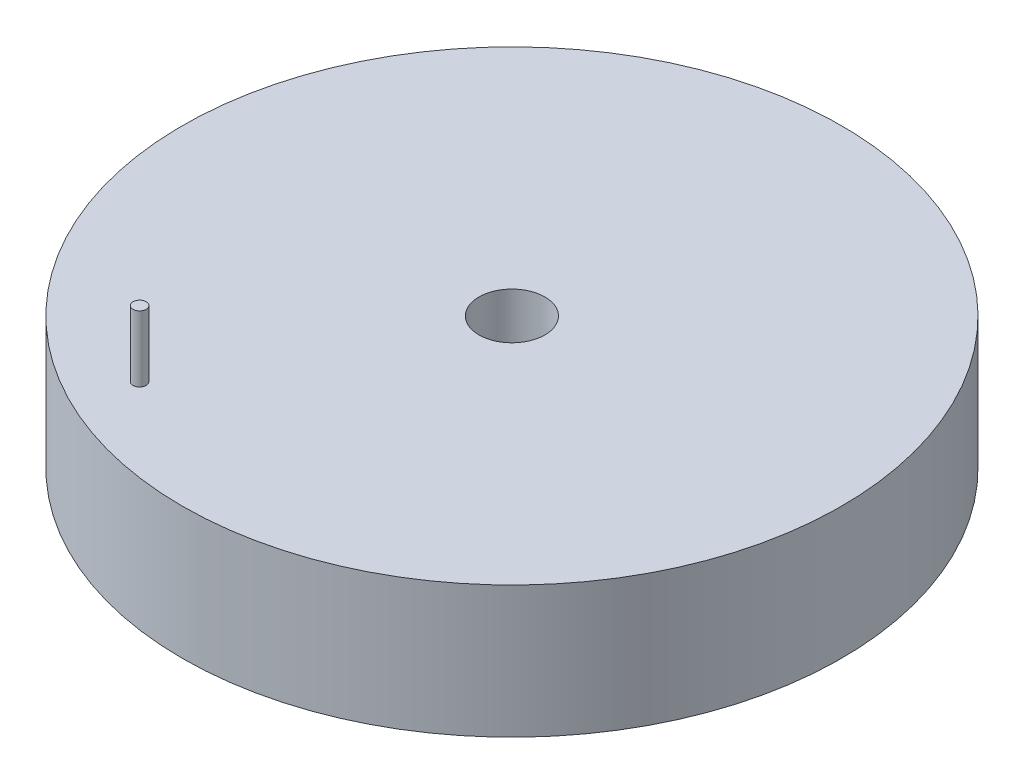
ISO-10303-21;
HEADER;
FILE_DESCRIPTION(('STEP AP214'),'2;1');
FILE_NAME('part.step','',(''),(''),'','','');
FILE_SCHEMA(('AUTOMOTIVE_DESIGN { 1 0 10303 214 1 1 1 1 }'));
ENDSEC;
DATA;
#1=APPLICATION_CONTEXT('core data for automotive mechanical design processes');
#2=APPLICATION_PROTOCOL_DEFINITION('international standard','automotive_design',2000,#1);
#3=PRODUCT_CONTEXT('',#1,'mechanical');
#4=PRODUCT('Part','Part','',(#3));
#5=PRODUCT_RELATED_PRODUCT_CATEGORY('part','',(#4));
#6=PRODUCT_DEFINITION_FORMATION('','',#4);
#7=PRODUCT_DEFINITION_CONTEXT('part definition',#1,'design');
#8=PRODUCT_DEFINITION('design','',#6,#7);
#9=PRODUCT_DEFINITION_SHAPE('','',#8);
#10=(LENGTH_UNIT() NAMED_UNIT(*) SI_UNIT(.MILLI.,.METRE.));
#11=(NAMED_UNIT(*) PLANE_ANGLE_UNIT() SI_UNIT($,.RADIAN.));
#12=(NAMED_UNIT(*) SI_UNIT($,.STERADIAN.) SOLID_ANGLE_UNIT());
#13=UNCERTAINTY_MEASURE_WITH_UNIT(LENGTH_MEASURE(1.E-05),#10,'distance_accuracy_value','');
#14=(GEOMETRIC_REPRESENTATION_CONTEXT(3) GLOBAL_UNCERTAINTY_ASSIGNED_CONTEXT((#13)) GLOBAL_UNIT_ASSIGNED_CONTEXT((#10,
#11,#12)) REPRESENTATION_CONTEXT('',''));
#15=CARTESIAN_POINT('',(0.,0.,0.));
#16=DIRECTION('',(0.,0.,1.));
#17=DIRECTION('',(1.,0.,0.));
#18=AXIS2_PLACEMENT_3D('',#15,#16,#17);
#19=CARTESIAN_POINT('',(0.,20.,0.));
#20=DIRECTION('',(0.,-1.,0.));
#21=DIRECTION('',(0.,0.,-1.));
#22=AXIS2_PLACEMENT_3D('',#19,#20,#21);
#23=CYLINDRICAL_SURFACE('',#22,50.);
#24=CARTESIAN_POINT('',(0.,20.,0.));
#25=DIRECTION('',(0.,1.,0.));
#26=DIRECTION('',(0.,0.,1.));
#27=AXIS2_PLACEMENT_3D('',#24,#25,#26);
#28=CIRCLE('',#27,50.);
#29=CARTESIAN_POINT('',(0.,20.,50.));
#30=VERTEX_POINT('',#29);
#31=EDGE_CURVE('E10',#30,#30,#28,.T.);
#32=ORIENTED_EDGE('',*,*,#31,.F.);
#33=EDGE_LOOP('',(#32));
#34=FACE_BOUND('',#33,.T.);
#35=CARTESIAN_POINT('',(0.,0.,0.));
#36=DIRECTION('',(0.,1.,0.));
#37=DIRECTION('',(0.,0.,1.));
#38=AXIS2_PLACEMENT_3D('',#35,#36,#37);
#39=CIRCLE('',#38,50.);
#40=CARTESIAN_POINT('',(0.,0.,50.));
#41=VERTEX_POINT('',#40);
#42=EDGE_CURVE('E40',#41,#41,#39,.T.);
#43=ORIENTED_EDGE('',*,*,#42,.T.);
#44=EDGE_LOOP('',(#43));
#45=FACE_BOUND('',#44,.T.);
#46=ADVANCED_FACE('F37',(#34,#45),#23,.T.);
#47=CARTESIAN_POINT('',(0.,20.,0.));
#48=DIRECTION('',(0.,1.,0.));
#49=DIRECTION('',(0.,0.,1.));
#50=AXIS2_PLACEMENT_3D('',#47,#48,#49);
#51=PLANE('',#50);
#52=CARTESIAN_POINT('',(-19.6114819270861,20.,36.8772539263773));
#53=DIRECTION('',(0.,1.,0.));
#54=DIRECTION('',(0.,0.,1.));
#55=AXIS2_PLACEMENT_3D('',#52,#53,#54);
#56=CIRCLE('',#55,1.);
#57=CARTESIAN_POINT('',(-19.6114819270861,20.,37.8772539263773));
#58=VERTEX_POINT('',#57);
#59=EDGE_CURVE('E59',#58,#58,#56,.T.);
#60=ORIENTED_EDGE('',*,*,#59,.F.);
#61=EDGE_LOOP('',(#60));
#62=FACE_BOUND('',#61,.T.);
#63=CARTESIAN_POINT('',(0.,20.,0.));
#64=DIRECTION('',(0.,-1.,0.));
#65=DIRECTION('',(0.,0.,-1.));
#66=AXIS2_PLACEMENT_3D('',#63,#64,#65);
#67=CIRCLE('',#66,5.);
#68=CARTESIAN_POINT('',(0.,20.,-5.));
#69=VERTEX_POINT('',#68);
#70=EDGE_CURVE('E49',#69,#69,#67,.T.);
#71=ORIENTED_EDGE('',*,*,#70,.T.);
#72=EDGE_LOOP('',(#71));
#73=FACE_BOUND('',#72,.T.);
#74=ORIENTED_EDGE('',*,*,#31,.T.);
#75=EDGE_LOOP('',(#74));
#76=FACE_BOUND('',#75,.T.);
#77=ADVANCED_FACE('F76',(#62,#73,#76),#51,.T.);
#78=CARTESIAN_POINT('',(0.,0.,0.));
#79=DIRECTION('',(0.,1.,0.));
#80=DIRECTION('',(0.,0.,1.));
#81=AXIS2_PLACEMENT_3D('',#78,#79,#80);
#82=PLANE('',#81);
#83=CARTESIAN_POINT('',(0.,0.,0.));
#84=DIRECTION('',(0.,-1.,0.));
#85=DIRECTION('',(0.,0.,-1.));
#86=AXIS2_PLACEMENT_3D('',#83,#84,#85);
#87=CIRCLE('',#86,5.);
#88=CARTESIAN_POINT('',(0.,0.,-5.));
#89=VERTEX_POINT('',#88);
#90=EDGE_CURVE('E51',#89,#89,#87,.T.);
#91=ORIENTED_EDGE('',*,*,#90,.F.);
#92=EDGE_LOOP('',(#91));
#93=FACE_BOUND('',#92,.T.);
#94=ORIENTED_EDGE('',*,*,#42,.F.);
#95=EDGE_LOOP('',(#94));
#96=FACE_BOUND('',#95,.T.);
#97=ADVANCED_FACE('F79',(#93,#96),#82,.F.);
#98=CARTESIAN_POINT('',(0.,20.,0.));
#99=DIRECTION('',(0.,-1.,0.));
#100=DIRECTION('',(0.,0.,-1.));
#101=AXIS2_PLACEMENT_3D('',#98,#99,#100);
#102=CYLINDRICAL_SURFACE('',#101,5.);
#103=ORIENTED_EDGE('',*,*,#70,.F.);
#104=EDGE_LOOP('',(#103));
#105=FACE_BOUND('',#104,.T.);
#106=ORIENTED_EDGE('',*,*,#90,.T.);
#107=EDGE_LOOP('',(#106));
#108=FACE_BOUND('',#107,.T.);
#109=ADVANCED_FACE('F72',(#105,#108),#102,.F.);
#110=CARTESIAN_POINT('',(-19.6114819270861,30.,36.8772539263773));
#111=DIRECTION('',(0.,-1.,0.));
#112=DIRECTION('',(0.,0.,-1.));
#113=AXIS2_PLACEMENT_3D('',#110,#111,#112);
#114=CYLINDRICAL_SURFACE('',#113,1.);
#115=CARTESIAN_POINT('',(-19.6114819270861,30.,36.8772539263773));
#116=DIRECTION('',(0.,1.,0.));
#117=DIRECTION('',(0.,0.,1.));
#118=AXIS2_PLACEMENT_3D('',#115,#116,#117);
#119=CIRCLE('',#118,1.);
#120=CARTESIAN_POINT('',(-19.6114819270861,30.,37.8772539263773));
#121=VERTEX_POINT('',#120);
#122=EDGE_CURVE('E55',#121,#121,#119,.T.);
#123=ORIENTED_EDGE('',*,*,#122,.F.);
#124=EDGE_LOOP('',(#123));
#125=FACE_BOUND('',#124,.T.);
#126=ORIENTED_EDGE('',*,*,#59,.T.);
#127=EDGE_LOOP('',(#126));
#128=FACE_BOUND('',#127,.T.);
#129=ADVANCED_FACE('F69',(#125,#128),#114,.T.);
#130=CARTESIAN_POINT('',(-19.6114819270861,30.,36.8772539263773));
#131=DIRECTION('',(0.,1.,0.));
#132=DIRECTION('',(0.,0.,1.));
#133=AXIS2_PLACEMENT_3D('',#130,#131,#132);
#134=PLANE('',#133);
#135=ORIENTED_EDGE('',*,*,#122,.T.);
#136=EDGE_LOOP('',(#135));
#137=FACE_BOUND('',#136,.T.);
#138=ADVANCED_FACE('F67',(#137),#134,.T.);
#139=CLOSED_SHELL('',(#46,#77,#97,#109,#129,#138));
#140=MANIFOLD_SOLID_BREP('B2',#139);
#141=ADVANCED_BREP_SHAPE_REPRESENTATION('',(#18,#140),#14);
#142=SHAPE_DEFINITION_REPRESENTATION(#9,#141);
ENDSEC;
END-ISO-10303-21;
